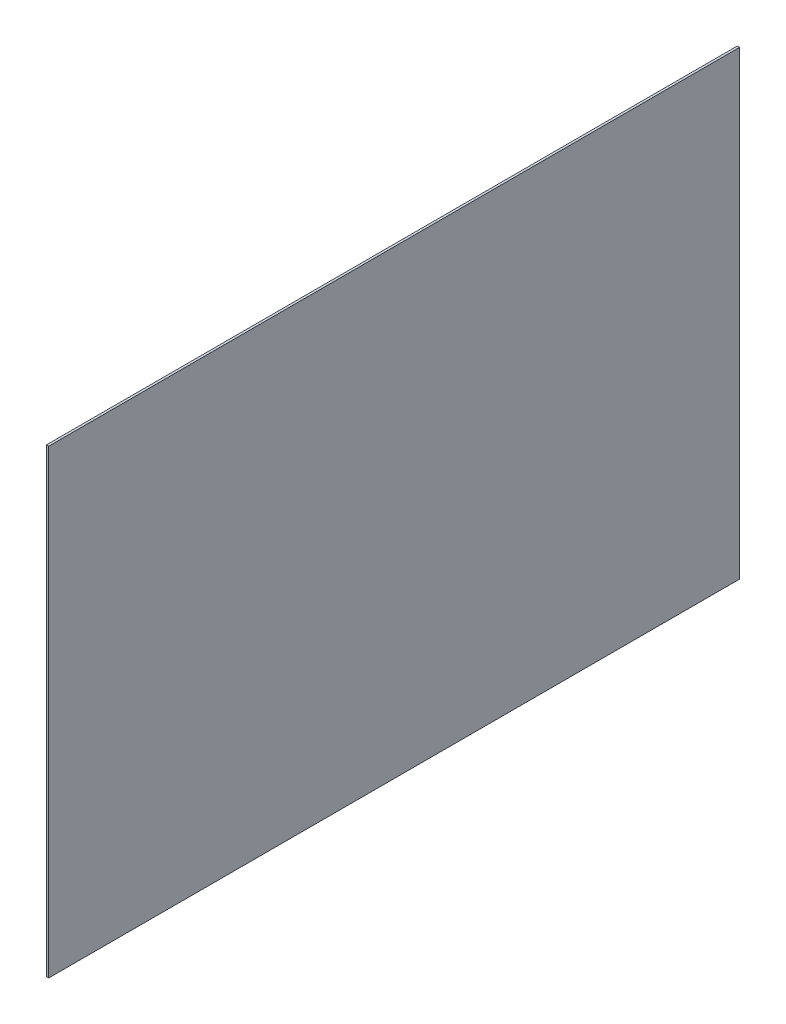
ISO-10303-21;
HEADER;
FILE_DESCRIPTION(('STEP AP214'),'2;1');
FILE_NAME('part.step','',(''),(''),'','','');
FILE_SCHEMA(('AUTOMOTIVE_DESIGN { 1 0 10303 214 1 1 1 1 }'));
ENDSEC;
DATA;
#1=APPLICATION_CONTEXT('core data for automotive mechanical design processes');
#2=APPLICATION_PROTOCOL_DEFINITION('international standard','automotive_design',2000,#1);
#3=PRODUCT_CONTEXT('',#1,'mechanical');
#4=PRODUCT('Part','Part','',(#3));
#5=PRODUCT_RELATED_PRODUCT_CATEGORY('part','',(#4));
#6=PRODUCT_DEFINITION_FORMATION('','',#4);
#7=PRODUCT_DEFINITION_CONTEXT('part definition',#1,'design');
#8=PRODUCT_DEFINITION('design','',#6,#7);
#9=PRODUCT_DEFINITION_SHAPE('','',#8);
#10=(LENGTH_UNIT() NAMED_UNIT(*) SI_UNIT(.MILLI.,.METRE.));
#11=(NAMED_UNIT(*) PLANE_ANGLE_UNIT() SI_UNIT($,.RADIAN.));
#12=(NAMED_UNIT(*) SI_UNIT($,.STERADIAN.) SOLID_ANGLE_UNIT());
#13=UNCERTAINTY_MEASURE_WITH_UNIT(LENGTH_MEASURE(1.E-05),#10,'distance_accuracy_value','');
#14=(GEOMETRIC_REPRESENTATION_CONTEXT(3) GLOBAL_UNCERTAINTY_ASSIGNED_CONTEXT((#13)) GLOBAL_UNIT_ASSIGNED_CONTEXT((#10,
#11,#12)) REPRESENTATION_CONTEXT('',''));
#15=CARTESIAN_POINT('',(0.,0.,0.));
#16=DIRECTION('',(0.,0.,1.));
#17=DIRECTION('',(1.,0.,0.));
#18=AXIS2_PLACEMENT_3D('',#15,#16,#17);
#19=CARTESIAN_POINT('',(-11.5,-10.,-15.));
#20=DIRECTION('',(0.,-1.,0.));
#21=DIRECTION('',(0.,0.,-1.));
#22=AXIS2_PLACEMENT_3D('',#19,#20,#21);
#23=PLANE('',#22);
#24=DIRECTION('',(1.,0.,0.));
#25=VECTOR('',#24,1.);
#26=CARTESIAN_POINT('',(-11.5,-10.,15.));
#27=LINE('',#26,#25);
#28=CARTESIAN_POINT('',(-11.6,-10.,15.));
#29=VERTEX_POINT('',#28);
#30=CARTESIAN_POINT('',(-11.5,-10.,15.));
#31=VERTEX_POINT('',#30);
#32=EDGE_CURVE('E11',#29,#31,#27,.T.);
#33=ORIENTED_EDGE('',*,*,#32,.F.);
#34=DIRECTION('',(0.,0.,-1.));
#35=VECTOR('',#34,1.);
#36=CARTESIAN_POINT('',(-11.6,-10.,-15.));
#37=LINE('',#36,#35);
#38=CARTESIAN_POINT('',(-11.6,-10.,-15.));
#39=VERTEX_POINT('',#38);
#40=EDGE_CURVE('E92',#29,#39,#37,.T.);
#41=ORIENTED_EDGE('',*,*,#40,.T.);
#42=DIRECTION('',(1.,0.,0.));
#43=VECTOR('',#42,1.);
#44=CARTESIAN_POINT('',(-11.5,-10.,-15.));
#45=LINE('',#44,#43);
#46=CARTESIAN_POINT('',(-11.5,-10.,-15.));
#47=VERTEX_POINT('',#46);
#48=EDGE_CURVE('E47',#39,#47,#45,.T.);
#49=ORIENTED_EDGE('',*,*,#48,.T.);
#50=DIRECTION('',(0.,0.,-1.));
#51=VECTOR('',#50,1.);
#52=CARTESIAN_POINT('',(-11.5,-10.,-15.));
#53=LINE('',#52,#51);
#54=EDGE_CURVE('E105',#31,#47,#53,.T.);
#55=ORIENTED_EDGE('',*,*,#54,.F.);
#56=EDGE_LOOP('',(#33,#41,#49,#55));
#57=FACE_BOUND('',#56,.T.);
#58=ADVANCED_FACE('F37',(#57),#23,.T.);
#59=CARTESIAN_POINT('',(-11.5,-10.,-15.));
#60=DIRECTION('',(0.,0.,-1.));
#61=DIRECTION('',(0.,1.,0.));
#62=AXIS2_PLACEMENT_3D('',#59,#60,#61);
#63=PLANE('',#62);
#64=ORIENTED_EDGE('',*,*,#48,.F.);
#65=DIRECTION('',(0.,1.,0.));
#66=VECTOR('',#65,1.);
#67=CARTESIAN_POINT('',(-11.6,-10.,-15.));
#68=LINE('',#67,#66);
#69=CARTESIAN_POINT('',(-11.6,10.,-15.));
#70=VERTEX_POINT('',#69);
#71=EDGE_CURVE('E99',#39,#70,#68,.T.);
#72=ORIENTED_EDGE('',*,*,#71,.T.);
#73=DIRECTION('',(1.,0.,0.));
#74=VECTOR('',#73,1.);
#75=CARTESIAN_POINT('',(-11.5,10.,-15.));
#76=LINE('',#75,#74);
#77=CARTESIAN_POINT('',(-11.5,10.,-15.));
#78=VERTEX_POINT('',#77);
#79=EDGE_CURVE('E55',#70,#78,#76,.T.);
#80=ORIENTED_EDGE('',*,*,#79,.T.);
#81=DIRECTION('',(0.,1.,0.));
#82=VECTOR('',#81,1.);
#83=CARTESIAN_POINT('',(-11.5,-10.,-15.));
#84=LINE('',#83,#82);
#85=EDGE_CURVE('E86',#47,#78,#84,.T.);
#86=ORIENTED_EDGE('',*,*,#85,.F.);
#87=EDGE_LOOP('',(#64,#72,#80,#86));
#88=FACE_BOUND('',#87,.T.);
#89=ADVANCED_FACE('F109',(#88),#63,.T.);
#90=CARTESIAN_POINT('',(-11.5,10.,-15.));
#91=DIRECTION('',(0.,-1.,0.));
#92=DIRECTION('',(0.,0.,-1.));
#93=AXIS2_PLACEMENT_3D('',#90,#91,#92);
#94=PLANE('',#93);
#95=ORIENTED_EDGE('',*,*,#79,.F.);
#96=DIRECTION('',(0.,0.,-1.));
#97=VECTOR('',#96,1.);
#98=CARTESIAN_POINT('',(-11.6,10.,-15.));
#99=LINE('',#98,#97);
#100=CARTESIAN_POINT('',(-11.6,10.,15.));
#101=VERTEX_POINT('',#100);
#102=EDGE_CURVE('E91',#101,#70,#99,.T.);
#103=ORIENTED_EDGE('',*,*,#102,.F.);
#104=DIRECTION('',(1.,0.,0.));
#105=VECTOR('',#104,1.);
#106=CARTESIAN_POINT('',(-11.5,10.,15.));
#107=LINE('',#106,#105);
#108=CARTESIAN_POINT('',(-11.5,10.,15.));
#109=VERTEX_POINT('',#108);
#110=EDGE_CURVE('E41',#101,#109,#107,.T.);
#111=ORIENTED_EDGE('',*,*,#110,.T.);
#112=DIRECTION('',(0.,0.,-1.));
#113=VECTOR('',#112,1.);
#114=CARTESIAN_POINT('',(-11.5,10.,-15.));
#115=LINE('',#114,#113);
#116=EDGE_CURVE('E101',#109,#78,#115,.T.);
#117=ORIENTED_EDGE('',*,*,#116,.T.);
#118=EDGE_LOOP('',(#95,#103,#111,#117));
#119=FACE_BOUND('',#118,.T.);
#120=ADVANCED_FACE('F94',(#119),#94,.F.);
#121=CARTESIAN_POINT('',(-11.5,-10.,15.));
#122=DIRECTION('',(0.,0.,-1.));
#123=DIRECTION('',(0.,1.,0.));
#124=AXIS2_PLACEMENT_3D('',#121,#122,#123);
#125=PLANE('',#124);
#126=DIRECTION('',(0.,1.,0.));
#127=VECTOR('',#126,1.);
#128=CARTESIAN_POINT('',(-11.6,-10.,15.));
#129=LINE('',#128,#127);
#130=EDGE_CURVE('E80',#29,#101,#129,.T.);
#131=ORIENTED_EDGE('',*,*,#130,.F.);
#132=ORIENTED_EDGE('',*,*,#32,.T.);
#133=DIRECTION('',(0.,1.,0.));
#134=VECTOR('',#133,1.);
#135=CARTESIAN_POINT('',(-11.5,-10.,15.));
#136=LINE('',#135,#134);
#137=EDGE_CURVE('E82',#31,#109,#136,.T.);
#138=ORIENTED_EDGE('',*,*,#137,.T.);
#139=ORIENTED_EDGE('',*,*,#110,.F.);
#140=EDGE_LOOP('',(#131,#132,#138,#139));
#141=FACE_BOUND('',#140,.T.);
#142=ADVANCED_FACE('F39',(#141),#125,.F.);
#143=CARTESIAN_POINT('',(-11.5,-10.,-15.));
#144=DIRECTION('',(1.,0.,0.));
#145=DIRECTION('',(0.,0.,-1.));
#146=AXIS2_PLACEMENT_3D('',#143,#144,#145);
#147=PLANE('',#146);
#148=ORIENTED_EDGE('',*,*,#116,.F.);
#149=ORIENTED_EDGE('',*,*,#137,.F.);
#150=ORIENTED_EDGE('',*,*,#54,.T.);
#151=ORIENTED_EDGE('',*,*,#85,.T.);
#152=EDGE_LOOP('',(#148,#149,#150,#151));
#153=FACE_BOUND('',#152,.T.);
#154=ADVANCED_FACE('F108',(#153),#147,.T.);
#155=CARTESIAN_POINT('',(-11.6,-10.,-15.));
#156=DIRECTION('',(1.,0.,0.));
#157=DIRECTION('',(0.,0.,-1.));
#158=AXIS2_PLACEMENT_3D('',#155,#156,#157);
#159=PLANE('',#158);
#160=ORIENTED_EDGE('',*,*,#102,.T.);
#161=ORIENTED_EDGE('',*,*,#71,.F.);
#162=ORIENTED_EDGE('',*,*,#40,.F.);
#163=ORIENTED_EDGE('',*,*,#130,.T.);
#164=EDGE_LOOP('',(#160,#161,#162,#163));
#165=FACE_BOUND('',#164,.T.);
#166=ADVANCED_FACE('F89',(#165),#159,.F.);
#167=CLOSED_SHELL('',(#58,#89,#120,#142,#154,#166));
#168=MANIFOLD_SOLID_BREP('B2',#167);
#169=ADVANCED_BREP_SHAPE_REPRESENTATION('',(#18,#168),#14);
#170=SHAPE_DEFINITION_REPRESENTATION(#9,#169);
ENDSEC;
END-ISO-10303-21;
